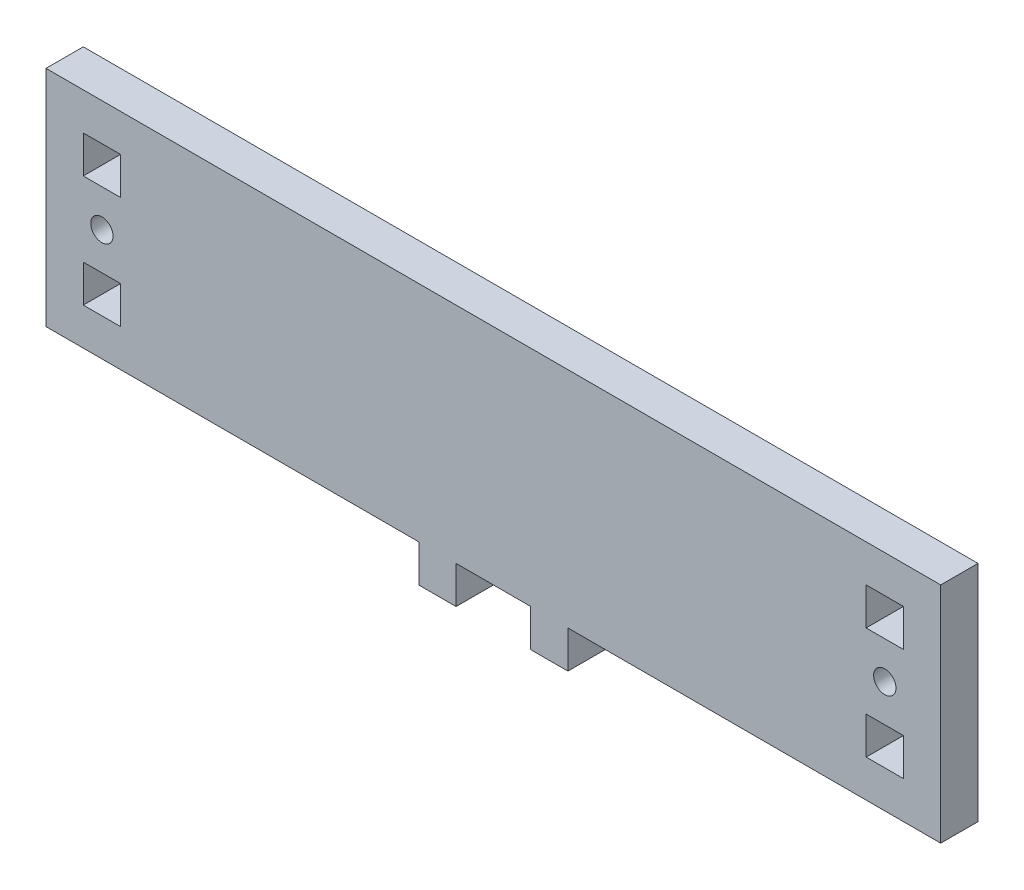
ISO-10303-21;
HEADER;
FILE_DESCRIPTION(('STEP AP214'),'2;1');
FILE_NAME('part.step','',(''),(''),'','','');
FILE_SCHEMA(('AUTOMOTIVE_DESIGN { 1 0 10303 214 1 1 1 1 }'));
ENDSEC;
DATA;
#1=APPLICATION_CONTEXT('core data for automotive mechanical design processes');
#2=APPLICATION_PROTOCOL_DEFINITION('international standard','automotive_design',2000,#1);
#3=PRODUCT_CONTEXT('',#1,'mechanical');
#4=PRODUCT('Part','Part','',(#3));
#5=PRODUCT_RELATED_PRODUCT_CATEGORY('part','',(#4));
#6=PRODUCT_DEFINITION_FORMATION('','',#4);
#7=PRODUCT_DEFINITION_CONTEXT('part definition',#1,'design');
#8=PRODUCT_DEFINITION('design','',#6,#7);
#9=PRODUCT_DEFINITION_SHAPE('','',#8);
#10=(LENGTH_UNIT() NAMED_UNIT(*) SI_UNIT(.MILLI.,.METRE.));
#11=(NAMED_UNIT(*) PLANE_ANGLE_UNIT() SI_UNIT($,.RADIAN.));
#12=(NAMED_UNIT(*) SI_UNIT($,.STERADIAN.) SOLID_ANGLE_UNIT());
#13=UNCERTAINTY_MEASURE_WITH_UNIT(LENGTH_MEASURE(1.E-05),#10,'distance_accuracy_value','');
#14=(GEOMETRIC_REPRESENTATION_CONTEXT(3) GLOBAL_UNCERTAINTY_ASSIGNED_CONTEXT((#13)) GLOBAL_UNIT_ASSIGNED_CONTEXT((#10,
#11,#12)) REPRESENTATION_CONTEXT('',''));
#15=CARTESIAN_POINT('',(0.,0.,0.));
#16=DIRECTION('',(0.,0.,1.));
#17=DIRECTION('',(1.,0.,0.));
#18=AXIS2_PLACEMENT_3D('',#15,#16,#17);
#19=CARTESIAN_POINT('',(0.,0.,5.));
#20=DIRECTION('',(0.,0.,-1.));
#21=DIRECTION('',(-1.,0.,0.));
#22=AXIS2_PLACEMENT_3D('',#19,#20,#21);
#23=PLANE('',#22);
#24=DIRECTION('',(-1.,0.,0.));
#25=VECTOR('',#24,1.);
#26=CARTESIAN_POINT('',(45.,15.0153904422342,5.));
#27=LINE('',#26,#25);
#28=CARTESIAN_POINT('',(50.,15.0153904422342,5.));
#29=VERTEX_POINT('',#28);
#30=CARTESIAN_POINT('',(45.,15.0153904422342,5.));
#31=VERTEX_POINT('',#30);
#32=EDGE_CURVE('E276',#29,#31,#27,.T.);
#33=ORIENTED_EDGE('',*,*,#32,.F.);
#34=DIRECTION('',(0.,1.,0.));
#35=VECTOR('',#34,1.);
#36=CARTESIAN_POINT('',(50.,15.0153904422342,5.));
#37=LINE('',#36,#35);
#38=CARTESIAN_POINT('',(50.,10.0153904422342,5.));
#39=VERTEX_POINT('',#38);
#40=EDGE_CURVE('E287',#39,#29,#37,.T.);
#41=ORIENTED_EDGE('',*,*,#40,.F.);
#42=DIRECTION('',(1.,0.,0.));
#43=VECTOR('',#42,1.);
#44=CARTESIAN_POINT('',(45.,10.0153904422342,5.));
#45=LINE('',#44,#43);
#46=CARTESIAN_POINT('',(45.,10.0153904422342,5.));
#47=VERTEX_POINT('',#46);
#48=EDGE_CURVE('E283',#47,#39,#45,.T.);
#49=ORIENTED_EDGE('',*,*,#48,.F.);
#50=DIRECTION('',(0.,-1.,0.));
#51=VECTOR('',#50,1.);
#52=CARTESIAN_POINT('',(45.,15.0153904422342,5.));
#53=LINE('',#52,#51);
#54=EDGE_CURVE('E279',#31,#47,#53,.T.);
#55=ORIENTED_EDGE('',*,*,#54,.F.);
#56=EDGE_LOOP('',(#33,#41,#49,#55));
#57=FACE_BOUND('',#56,.T.);
#58=DIRECTION('',(-1.,0.,0.));
#59=VECTOR('',#58,1.);
#60=CARTESIAN_POINT('',(-60.,15.0153904422342,5.));
#61=LINE('',#60,#59);
#62=CARTESIAN_POINT('',(-55.,15.0153904422342,5.));
#63=VERTEX_POINT('',#62);
#64=CARTESIAN_POINT('',(-60.,15.0153904422342,5.));
#65=VERTEX_POINT('',#64);
#66=EDGE_CURVE('E370',#63,#65,#61,.T.);
#67=ORIENTED_EDGE('',*,*,#66,.F.);
#68=DIRECTION('',(0.,1.,0.));
#69=VECTOR('',#68,1.);
#70=CARTESIAN_POINT('',(-55.,15.0153904422342,5.));
#71=LINE('',#70,#69);
#72=CARTESIAN_POINT('',(-55.,10.0153904422342,5.));
#73=VERTEX_POINT('',#72);
#74=EDGE_CURVE('E381',#73,#63,#71,.T.);
#75=ORIENTED_EDGE('',*,*,#74,.F.);
#76=DIRECTION('',(1.,0.,0.));
#77=VECTOR('',#76,1.);
#78=CARTESIAN_POINT('',(-60.,10.0153904422342,5.));
#79=LINE('',#78,#77);
#80=CARTESIAN_POINT('',(-60.,10.0153904422342,5.));
#81=VERTEX_POINT('',#80);
#82=EDGE_CURVE('E377',#81,#73,#79,.T.);
#83=ORIENTED_EDGE('',*,*,#82,.F.);
#84=DIRECTION('',(0.,-1.,0.));
#85=VECTOR('',#84,1.);
#86=CARTESIAN_POINT('',(-60.,15.0153904422342,5.));
#87=LINE('',#86,#85);
#88=EDGE_CURVE('E373',#65,#81,#87,.T.);
#89=ORIENTED_EDGE('',*,*,#88,.F.);
#90=EDGE_LOOP('',(#67,#75,#83,#89));
#91=FACE_BOUND('',#90,.T.);
#92=DIRECTION('',(1.,0.,0.));
#93=VECTOR('',#92,1.);
#94=CARTESIAN_POINT('',(5.,0.,5.));
#95=LINE('',#94,#93);
#96=CARTESIAN_POINT('',(0.,0.,5.));
#97=VERTEX_POINT('',#96);
#98=CARTESIAN_POINT('',(5.,0.,5.));
#99=VERTEX_POINT('',#98);
#100=EDGE_CURVE('E413',#97,#99,#95,.T.);
#101=ORIENTED_EDGE('',*,*,#100,.T.);
#102=DIRECTION('',(0.,1.,0.));
#103=VECTOR('',#102,1.);
#104=CARTESIAN_POINT('',(5.,5.01539044223422,5.));
#105=LINE('',#104,#103);
#106=CARTESIAN_POINT('',(5.,5.01539044223422,5.));
#107=VERTEX_POINT('',#106);
#108=EDGE_CURVE('E417',#99,#107,#105,.T.);
#109=ORIENTED_EDGE('',*,*,#108,.T.);
#110=DIRECTION('',(1.,0.,0.));
#111=VECTOR('',#110,1.);
#112=CARTESIAN_POINT('',(55.,5.01539044223421,5.));
#113=LINE('',#112,#111);
#114=CARTESIAN_POINT('',(55.,5.01539044223421,5.));
#115=VERTEX_POINT('',#114);
#116=EDGE_CURVE('E421',#107,#115,#113,.T.);
#117=ORIENTED_EDGE('',*,*,#116,.T.);
#118=DIRECTION('',(0.,1.,0.));
#119=VECTOR('',#118,1.);
#120=CARTESIAN_POINT('',(55.,35.0153904422342,5.));
#121=LINE('',#120,#119);
#122=CARTESIAN_POINT('',(55.,35.0153904422342,5.));
#123=VERTEX_POINT('',#122);
#124=EDGE_CURVE('E424',#115,#123,#121,.T.);
#125=ORIENTED_EDGE('',*,*,#124,.T.);
#126=DIRECTION('',(-1.,0.,0.));
#127=VECTOR('',#126,1.);
#128=CARTESIAN_POINT('',(-65.,35.0153904422342,5.));
#129=LINE('',#128,#127);
#130=CARTESIAN_POINT('',(-65.,35.0153904422342,5.));
#131=VERTEX_POINT('',#130);
#132=EDGE_CURVE('E427',#123,#131,#129,.T.);
#133=ORIENTED_EDGE('',*,*,#132,.T.);
#134=DIRECTION('',(0.,-1.,0.));
#135=VECTOR('',#134,1.);
#136=CARTESIAN_POINT('',(-65.,5.01539044223421,5.));
#137=LINE('',#136,#135);
#138=CARTESIAN_POINT('',(-65.,5.01539044223421,5.));
#139=VERTEX_POINT('',#138);
#140=EDGE_CURVE('E430',#131,#139,#137,.T.);
#141=ORIENTED_EDGE('',*,*,#140,.T.);
#142=DIRECTION('',(1.,0.,0.));
#143=VECTOR('',#142,1.);
#144=CARTESIAN_POINT('',(-15.,5.01539044223421,5.));
#145=LINE('',#144,#143);
#146=CARTESIAN_POINT('',(-15.,5.01539044223421,5.));
#147=VERTEX_POINT('',#146);
#148=EDGE_CURVE('E433',#139,#147,#145,.T.);
#149=ORIENTED_EDGE('',*,*,#148,.T.);
#150=DIRECTION('',(0.,-1.,0.));
#151=VECTOR('',#150,1.);
#152=CARTESIAN_POINT('',(-15.,0.,5.));
#153=LINE('',#152,#151);
#154=CARTESIAN_POINT('',(-15.,0.,5.));
#155=VERTEX_POINT('',#154);
#156=EDGE_CURVE('E436',#147,#155,#153,.T.);
#157=ORIENTED_EDGE('',*,*,#156,.T.);
#158=DIRECTION('',(1.,0.,0.));
#159=VECTOR('',#158,1.);
#160=CARTESIAN_POINT('',(-10.,0.,5.));
#161=LINE('',#160,#159);
#162=CARTESIAN_POINT('',(-10.,0.,5.));
#163=VERTEX_POINT('',#162);
#164=EDGE_CURVE('E439',#155,#163,#161,.T.);
#165=ORIENTED_EDGE('',*,*,#164,.T.);
#166=DIRECTION('',(0.,1.,0.));
#167=VECTOR('',#166,1.);
#168=CARTESIAN_POINT('',(-10.,5.01539044223422,5.));
#169=LINE('',#168,#167);
#170=CARTESIAN_POINT('',(-10.,5.01539044223422,5.));
#171=VERTEX_POINT('',#170);
#172=EDGE_CURVE('E442',#163,#171,#169,.T.);
#173=ORIENTED_EDGE('',*,*,#172,.T.);
#174=DIRECTION('',(1.,0.,0.));
#175=VECTOR('',#174,1.);
#176=CARTESIAN_POINT('',(0.,5.01539044223422,5.));
#177=LINE('',#176,#175);
#178=CARTESIAN_POINT('',(0.,5.01539044223422,5.));
#179=VERTEX_POINT('',#178);
#180=EDGE_CURVE('E445',#171,#179,#177,.T.);
#181=ORIENTED_EDGE('',*,*,#180,.T.);
#182=DIRECTION('',(0.,-1.,0.));
#183=VECTOR('',#182,1.);
#184=CARTESIAN_POINT('',(0.,0.,5.));
#185=LINE('',#184,#183);
#186=EDGE_CURVE('E448',#179,#97,#185,.T.);
#187=ORIENTED_EDGE('',*,*,#186,.T.);
#188=EDGE_LOOP('',(#101,#109,#117,#125,#133,#141,#149,#157,#165,#173,#181,#187));
#189=FACE_BOUND('',#188,.T.);
#190=DIRECTION('',(1.,0.,0.));
#191=VECTOR('',#190,1.);
#192=CARTESIAN_POINT('',(-60.,25.0153904422342,5.));
#193=LINE('',#192,#191);
#194=CARTESIAN_POINT('',(-60.,25.0153904422342,5.));
#195=VERTEX_POINT('',#194);
#196=CARTESIAN_POINT('',(-55.,25.0153904422342,5.));
#197=VERTEX_POINT('',#196);
#198=EDGE_CURVE('E327',#195,#197,#193,.T.);
#199=ORIENTED_EDGE('',*,*,#198,.F.);
#200=DIRECTION('',(0.,-1.,0.));
#201=VECTOR('',#200,1.);
#202=CARTESIAN_POINT('',(-60.,25.0153904422342,5.));
#203=LINE('',#202,#201);
#204=CARTESIAN_POINT('',(-60.,30.0153904422342,5.));
#205=VERTEX_POINT('',#204);
#206=EDGE_CURVE('E338',#205,#195,#203,.T.);
#207=ORIENTED_EDGE('',*,*,#206,.F.);
#208=DIRECTION('',(-1.,0.,0.));
#209=VECTOR('',#208,1.);
#210=CARTESIAN_POINT('',(-60.,30.0153904422342,5.));
#211=LINE('',#210,#209);
#212=CARTESIAN_POINT('',(-55.,30.0153904422342,5.));
#213=VERTEX_POINT('',#212);
#214=EDGE_CURVE('E334',#213,#205,#211,.T.);
#215=ORIENTED_EDGE('',*,*,#214,.F.);
#216=DIRECTION('',(0.,1.,0.));
#217=VECTOR('',#216,1.);
#218=CARTESIAN_POINT('',(-55.,25.0153904422342,5.));
#219=LINE('',#218,#217);
#220=EDGE_CURVE('E330',#197,#213,#219,.T.);
#221=ORIENTED_EDGE('',*,*,#220,.F.);
#222=EDGE_LOOP('',(#199,#207,#215,#221));
#223=FACE_BOUND('',#222,.T.);
#224=CARTESIAN_POINT('',(-57.5,20.0153904422342,5.));
#225=DIRECTION('',(0.,0.,1.));
#226=DIRECTION('',(1.,0.,0.));
#227=AXIS2_PLACEMENT_3D('',#224,#225,#226);
#228=CIRCLE('',#227,1.5);
#229=CARTESIAN_POINT('',(-56.,20.0153904422342,5.));
#230=VERTEX_POINT('',#229);
#231=EDGE_CURVE('E319',#230,#230,#228,.T.);
#232=ORIENTED_EDGE('',*,*,#231,.F.);
#233=EDGE_LOOP('',(#232));
#234=FACE_BOUND('',#233,.T.);
#235=DIRECTION('',(1.,0.,0.));
#236=VECTOR('',#235,1.);
#237=CARTESIAN_POINT('',(45.,25.0153904422342,5.));
#238=LINE('',#237,#236);
#239=CARTESIAN_POINT('',(45.,25.0153904422342,5.));
#240=VERTEX_POINT('',#239);
#241=CARTESIAN_POINT('',(50.,25.0153904422342,5.));
#242=VERTEX_POINT('',#241);
#243=EDGE_CURVE('E225',#240,#242,#238,.T.);
#244=ORIENTED_EDGE('',*,*,#243,.F.);
#245=DIRECTION('',(0.,-1.,0.));
#246=VECTOR('',#245,1.);
#247=CARTESIAN_POINT('',(45.,25.0153904422342,5.));
#248=LINE('',#247,#246);
#249=CARTESIAN_POINT('',(45.,30.0153904422342,5.));
#250=VERTEX_POINT('',#249);
#251=EDGE_CURVE('E252',#250,#240,#248,.T.);
#252=ORIENTED_EDGE('',*,*,#251,.F.);
#253=DIRECTION('',(-1.,0.,0.));
#254=VECTOR('',#253,1.);
#255=CARTESIAN_POINT('',(45.,30.0153904422342,5.));
#256=LINE('',#255,#254);
#257=CARTESIAN_POINT('',(50.,30.0153904422342,5.));
#258=VERTEX_POINT('',#257);
#259=EDGE_CURVE('E248',#258,#250,#256,.T.);
#260=ORIENTED_EDGE('',*,*,#259,.F.);
#261=DIRECTION('',(0.,1.,0.));
#262=VECTOR('',#261,1.);
#263=CARTESIAN_POINT('',(50.,25.0153904422342,5.));
#264=LINE('',#263,#262);
#265=EDGE_CURVE('E234',#242,#258,#264,.T.);
#266=ORIENTED_EDGE('',*,*,#265,.F.);
#267=EDGE_LOOP('',(#244,#252,#260,#266));
#268=FACE_BOUND('',#267,.T.);
#269=CARTESIAN_POINT('',(47.5,20.0153904422342,5.));
#270=DIRECTION('',(0.,0.,1.));
#271=DIRECTION('',(1.,0.,0.));
#272=AXIS2_PLACEMENT_3D('',#269,#270,#271);
#273=CIRCLE('',#272,1.5);
#274=CARTESIAN_POINT('',(49.,20.0153904422342,5.));
#275=VERTEX_POINT('',#274);
#276=EDGE_CURVE('E260',#275,#275,#273,.T.);
#277=ORIENTED_EDGE('',*,*,#276,.F.);
#278=EDGE_LOOP('',(#277));
#279=FACE_BOUND('',#278,.T.);
#280=ADVANCED_FACE('F39',(#57,#91,#189,#223,#234,#268,#279),#23,.F.);
#281=CARTESIAN_POINT('',(0.,0.,0.));
#282=DIRECTION('',(0.,0.,-1.));
#283=DIRECTION('',(-1.,0.,0.));
#284=AXIS2_PLACEMENT_3D('',#281,#282,#283);
#285=PLANE('',#284);
#286=DIRECTION('',(0.,-1.,0.));
#287=VECTOR('',#286,1.);
#288=CARTESIAN_POINT('',(45.,25.0153904422342,0.));
#289=LINE('',#288,#287);
#290=CARTESIAN_POINT('',(45.,30.0153904422342,0.));
#291=VERTEX_POINT('',#290);
#292=CARTESIAN_POINT('',(45.,25.0153904422342,0.));
#293=VERTEX_POINT('',#292);
#294=EDGE_CURVE('E235',#291,#293,#289,.T.);
#295=ORIENTED_EDGE('',*,*,#294,.T.);
#296=DIRECTION('',(1.,0.,0.));
#297=VECTOR('',#296,1.);
#298=CARTESIAN_POINT('',(45.,25.0153904422342,0.));
#299=LINE('',#298,#297);
#300=CARTESIAN_POINT('',(50.,25.0153904422342,0.));
#301=VERTEX_POINT('',#300);
#302=EDGE_CURVE('E63',#293,#301,#299,.T.);
#303=ORIENTED_EDGE('',*,*,#302,.T.);
#304=DIRECTION('',(0.,1.,0.));
#305=VECTOR('',#304,1.);
#306=CARTESIAN_POINT('',(50.,25.0153904422342,0.));
#307=LINE('',#306,#305);
#308=CARTESIAN_POINT('',(50.,30.0153904422342,0.));
#309=VERTEX_POINT('',#308);
#310=EDGE_CURVE('E241',#301,#309,#307,.T.);
#311=ORIENTED_EDGE('',*,*,#310,.T.);
#312=DIRECTION('',(-1.,0.,0.));
#313=VECTOR('',#312,1.);
#314=CARTESIAN_POINT('',(45.,30.0153904422342,0.));
#315=LINE('',#314,#313);
#316=EDGE_CURVE('E263',#309,#291,#315,.T.);
#317=ORIENTED_EDGE('',*,*,#316,.T.);
#318=EDGE_LOOP('',(#295,#303,#311,#317));
#319=FACE_BOUND('',#318,.T.);
#320=DIRECTION('',(0.,1.,0.));
#321=VECTOR('',#320,1.);
#322=CARTESIAN_POINT('',(50.,15.0153904422342,0.));
#323=LINE('',#322,#321);
#324=CARTESIAN_POINT('',(50.,10.0153904422342,0.));
#325=VERTEX_POINT('',#324);
#326=CARTESIAN_POINT('',(50.,15.0153904422342,0.));
#327=VERTEX_POINT('',#326);
#328=EDGE_CURVE('E280',#325,#327,#323,.T.);
#329=ORIENTED_EDGE('',*,*,#328,.T.);
#330=DIRECTION('',(-1.,0.,0.));
#331=VECTOR('',#330,1.);
#332=CARTESIAN_POINT('',(45.,15.0153904422342,0.));
#333=LINE('',#332,#331);
#334=CARTESIAN_POINT('',(45.,15.0153904422342,0.));
#335=VERTEX_POINT('',#334);
#336=EDGE_CURVE('E243',#327,#335,#333,.T.);
#337=ORIENTED_EDGE('',*,*,#336,.T.);
#338=DIRECTION('',(0.,-1.,0.));
#339=VECTOR('',#338,1.);
#340=CARTESIAN_POINT('',(45.,15.0153904422342,0.));
#341=LINE('',#340,#339);
#342=CARTESIAN_POINT('',(45.,10.0153904422342,0.));
#343=VERTEX_POINT('',#342);
#344=EDGE_CURVE('E294',#335,#343,#341,.T.);
#345=ORIENTED_EDGE('',*,*,#344,.T.);
#346=DIRECTION('',(1.,0.,0.));
#347=VECTOR('',#346,1.);
#348=CARTESIAN_POINT('',(45.,10.0153904422342,0.));
#349=LINE('',#348,#347);
#350=EDGE_CURVE('E298',#343,#325,#349,.T.);
#351=ORIENTED_EDGE('',*,*,#350,.T.);
#352=EDGE_LOOP('',(#329,#337,#345,#351));
#353=FACE_BOUND('',#352,.T.);
#354=CARTESIAN_POINT('',(-57.5,20.0153904422342,0.));
#355=DIRECTION('',(0.,0.,1.));
#356=DIRECTION('',(1.,0.,0.));
#357=AXIS2_PLACEMENT_3D('',#354,#355,#356);
#358=CIRCLE('',#357,1.5);
#359=CARTESIAN_POINT('',(-56.,20.0153904422342,0.));
#360=VERTEX_POINT('',#359);
#361=EDGE_CURVE('E318',#360,#360,#358,.T.);
#362=ORIENTED_EDGE('',*,*,#361,.T.);
#363=EDGE_LOOP('',(#362));
#364=FACE_BOUND('',#363,.T.);
#365=DIRECTION('',(1.,0.,0.));
#366=VECTOR('',#365,1.);
#367=CARTESIAN_POINT('',(5.,0.,0.));
#368=LINE('',#367,#366);
#369=CARTESIAN_POINT('',(0.,0.,0.));
#370=VERTEX_POINT('',#369);
#371=CARTESIAN_POINT('',(5.,0.,0.));
#372=VERTEX_POINT('',#371);
#373=EDGE_CURVE('E412',#370,#372,#368,.T.);
#374=ORIENTED_EDGE('',*,*,#373,.F.);
#375=DIRECTION('',(0.,-1.,0.));
#376=VECTOR('',#375,1.);
#377=CARTESIAN_POINT('',(0.,0.,0.));
#378=LINE('',#377,#376);
#379=CARTESIAN_POINT('',(0.,5.01539044223422,0.));
#380=VERTEX_POINT('',#379);
#381=EDGE_CURVE('E418',#380,#370,#378,.T.);
#382=ORIENTED_EDGE('',*,*,#381,.F.);
#383=DIRECTION('',(1.,0.,0.));
#384=VECTOR('',#383,1.);
#385=CARTESIAN_POINT('',(0.,5.01539044223422,0.));
#386=LINE('',#385,#384);
#387=CARTESIAN_POINT('',(-10.,5.01539044223422,0.));
#388=VERTEX_POINT('',#387);
#389=EDGE_CURVE('E482',#388,#380,#386,.T.);
#390=ORIENTED_EDGE('',*,*,#389,.F.);
#391=DIRECTION('',(0.,1.,0.));
#392=VECTOR('',#391,1.);
#393=CARTESIAN_POINT('',(-10.,5.01539044223422,0.));
#394=LINE('',#393,#392);
#395=CARTESIAN_POINT('',(-10.,0.,0.));
#396=VERTEX_POINT('',#395);
#397=EDGE_CURVE('E479',#396,#388,#394,.T.);
#398=ORIENTED_EDGE('',*,*,#397,.F.);
#399=DIRECTION('',(1.,0.,0.));
#400=VECTOR('',#399,1.);
#401=CARTESIAN_POINT('',(-10.,0.,0.));
#402=LINE('',#401,#400);
#403=CARTESIAN_POINT('',(-15.,0.,0.));
#404=VERTEX_POINT('',#403);
#405=EDGE_CURVE('E476',#404,#396,#402,.T.);
#406=ORIENTED_EDGE('',*,*,#405,.F.);
#407=DIRECTION('',(0.,-1.,0.));
#408=VECTOR('',#407,1.);
#409=CARTESIAN_POINT('',(-15.,0.,0.));
#410=LINE('',#409,#408);
#411=CARTESIAN_POINT('',(-15.,5.01539044223421,0.));
#412=VERTEX_POINT('',#411);
#413=EDGE_CURVE('E473',#412,#404,#410,.T.);
#414=ORIENTED_EDGE('',*,*,#413,.F.);
#415=DIRECTION('',(1.,0.,0.));
#416=VECTOR('',#415,1.);
#417=CARTESIAN_POINT('',(-15.,5.01539044223421,0.));
#418=LINE('',#417,#416);
#419=CARTESIAN_POINT('',(-65.,5.01539044223421,0.));
#420=VERTEX_POINT('',#419);
#421=EDGE_CURVE('E470',#420,#412,#418,.T.);
#422=ORIENTED_EDGE('',*,*,#421,.F.);
#423=DIRECTION('',(0.,-1.,0.));
#424=VECTOR('',#423,1.);
#425=CARTESIAN_POINT('',(-65.,5.01539044223421,0.));
#426=LINE('',#425,#424);
#427=CARTESIAN_POINT('',(-65.,35.0153904422342,0.));
#428=VERTEX_POINT('',#427);
#429=EDGE_CURVE('E467',#428,#420,#426,.T.);
#430=ORIENTED_EDGE('',*,*,#429,.F.);
#431=DIRECTION('',(-1.,0.,0.));
#432=VECTOR('',#431,1.);
#433=CARTESIAN_POINT('',(-65.,35.0153904422342,0.));
#434=LINE('',#433,#432);
#435=CARTESIAN_POINT('',(55.,35.0153904422342,0.));
#436=VERTEX_POINT('',#435);
#437=EDGE_CURVE('E464',#436,#428,#434,.T.);
#438=ORIENTED_EDGE('',*,*,#437,.F.);
#439=DIRECTION('',(0.,1.,0.));
#440=VECTOR('',#439,1.);
#441=CARTESIAN_POINT('',(55.,35.0153904422342,0.));
#442=LINE('',#441,#440);
#443=CARTESIAN_POINT('',(55.,5.01539044223421,0.));
#444=VERTEX_POINT('',#443);
#445=EDGE_CURVE('E461',#444,#436,#442,.T.);
#446=ORIENTED_EDGE('',*,*,#445,.F.);
#447=DIRECTION('',(1.,0.,0.));
#448=VECTOR('',#447,1.);
#449=CARTESIAN_POINT('',(55.,5.01539044223421,0.));
#450=LINE('',#449,#448);
#451=CARTESIAN_POINT('',(5.,5.01539044223422,0.));
#452=VERTEX_POINT('',#451);
#453=EDGE_CURVE('E458',#452,#444,#450,.T.);
#454=ORIENTED_EDGE('',*,*,#453,.F.);
#455=DIRECTION('',(0.,1.,0.));
#456=VECTOR('',#455,1.);
#457=CARTESIAN_POINT('',(5.,5.01539044223422,0.));
#458=LINE('',#457,#456);
#459=EDGE_CURVE('E455',#372,#452,#458,.T.);
#460=ORIENTED_EDGE('',*,*,#459,.F.);
#461=EDGE_LOOP('',(#374,#382,#390,#398,#406,#414,#422,#430,#438,#446,#454,#460));
#462=FACE_BOUND('',#461,.T.);
#463=DIRECTION('',(0.,1.,0.));
#464=VECTOR('',#463,1.);
#465=CARTESIAN_POINT('',(-55.,15.0153904422342,0.));
#466=LINE('',#465,#464);
#467=CARTESIAN_POINT('',(-55.,10.0153904422342,0.));
#468=VERTEX_POINT('',#467);
#469=CARTESIAN_POINT('',(-55.,15.0153904422342,0.));
#470=VERTEX_POINT('',#469);
#471=EDGE_CURVE('E374',#468,#470,#466,.T.);
#472=ORIENTED_EDGE('',*,*,#471,.T.);
#473=DIRECTION('',(-1.,0.,0.));
#474=VECTOR('',#473,1.);
#475=CARTESIAN_POINT('',(-60.,15.0153904422342,0.));
#476=LINE('',#475,#474);
#477=CARTESIAN_POINT('',(-60.,15.0153904422342,0.));
#478=VERTEX_POINT('',#477);
#479=EDGE_CURVE('E369',#470,#478,#476,.T.);
#480=ORIENTED_EDGE('',*,*,#479,.T.);
#481=DIRECTION('',(0.,-1.,0.));
#482=VECTOR('',#481,1.);
#483=CARTESIAN_POINT('',(-60.,15.0153904422342,0.));
#484=LINE('',#483,#482);
#485=CARTESIAN_POINT('',(-60.,10.0153904422342,0.));
#486=VERTEX_POINT('',#485);
#487=EDGE_CURVE('E388',#478,#486,#484,.T.);
#488=ORIENTED_EDGE('',*,*,#487,.T.);
#489=DIRECTION('',(1.,0.,0.));
#490=VECTOR('',#489,1.);
#491=CARTESIAN_POINT('',(-60.,10.0153904422342,0.));
#492=LINE('',#491,#490);
#493=EDGE_CURVE('E392',#486,#468,#492,.T.);
#494=ORIENTED_EDGE('',*,*,#493,.T.);
#495=EDGE_LOOP('',(#472,#480,#488,#494));
#496=FACE_BOUND('',#495,.T.);
#497=DIRECTION('',(0.,-1.,0.));
#498=VECTOR('',#497,1.);
#499=CARTESIAN_POINT('',(-60.,25.0153904422342,0.));
#500=LINE('',#499,#498);
#501=CARTESIAN_POINT('',(-60.,30.0153904422342,0.));
#502=VERTEX_POINT('',#501);
#503=CARTESIAN_POINT('',(-60.,25.0153904422342,0.));
#504=VERTEX_POINT('',#503);
#505=EDGE_CURVE('E331',#502,#504,#500,.T.);
#506=ORIENTED_EDGE('',*,*,#505,.T.);
#507=DIRECTION('',(1.,0.,0.));
#508=VECTOR('',#507,1.);
#509=CARTESIAN_POINT('',(-60.,25.0153904422342,0.));
#510=LINE('',#509,#508);
#511=CARTESIAN_POINT('',(-55.,25.0153904422342,0.));
#512=VERTEX_POINT('',#511);
#513=EDGE_CURVE('E323',#504,#512,#510,.T.);
#514=ORIENTED_EDGE('',*,*,#513,.T.);
#515=DIRECTION('',(0.,1.,0.));
#516=VECTOR('',#515,1.);
#517=CARTESIAN_POINT('',(-55.,25.0153904422342,0.));
#518=LINE('',#517,#516);
#519=CARTESIAN_POINT('',(-55.,30.0153904422342,0.));
#520=VERTEX_POINT('',#519);
#521=EDGE_CURVE('E345',#512,#520,#518,.T.);
#522=ORIENTED_EDGE('',*,*,#521,.T.);
#523=DIRECTION('',(-1.,0.,0.));
#524=VECTOR('',#523,1.);
#525=CARTESIAN_POINT('',(-60.,30.0153904422342,0.));
#526=LINE('',#525,#524);
#527=EDGE_CURVE('E349',#520,#502,#526,.T.);
#528=ORIENTED_EDGE('',*,*,#527,.T.);
#529=EDGE_LOOP('',(#506,#514,#522,#528));
#530=FACE_BOUND('',#529,.T.);
#531=CARTESIAN_POINT('',(47.5,20.0153904422342,0.));
#532=DIRECTION('',(0.,0.,1.));
#533=DIRECTION('',(1.,0.,0.));
#534=AXIS2_PLACEMENT_3D('',#531,#532,#533);
#535=CIRCLE('',#534,1.5);
#536=CARTESIAN_POINT('',(49.,20.0153904422342,0.));
#537=VERTEX_POINT('',#536);
#538=EDGE_CURVE('E883',#537,#537,#535,.T.);
#539=ORIENTED_EDGE('',*,*,#538,.T.);
#540=EDGE_LOOP('',(#539));
#541=FACE_BOUND('',#540,.T.);
#542=ADVANCED_FACE('F537',(#319,#353,#364,#462,#496,#530,#541),#285,.T.);
#543=CARTESIAN_POINT('',(5.,0.,5.));
#544=DIRECTION('',(0.,1.,0.));
#545=DIRECTION('',(-1.,0.,0.));
#546=AXIS2_PLACEMENT_3D('',#543,#544,#545);
#547=PLANE('',#546);
#548=ORIENTED_EDGE('',*,*,#373,.T.);
#549=DIRECTION('',(0.,0.,-1.));
#550=VECTOR('',#549,1.);
#551=CARTESIAN_POINT('',(5.,0.,5.));
#552=LINE('',#551,#550);
#553=EDGE_CURVE('E11',#99,#372,#552,.T.);
#554=ORIENTED_EDGE('',*,*,#553,.F.);
#555=ORIENTED_EDGE('',*,*,#100,.F.);
#556=DIRECTION('',(0.,0.,-1.));
#557=VECTOR('',#556,1.);
#558=CARTESIAN_POINT('',(0.,0.,5.));
#559=LINE('',#558,#557);
#560=EDGE_CURVE('E451',#97,#370,#559,.T.);
#561=ORIENTED_EDGE('',*,*,#560,.T.);
#562=EDGE_LOOP('',(#548,#554,#555,#561));
#563=FACE_BOUND('',#562,.T.);
#564=ADVANCED_FACE('F41',(#563),#547,.F.);
#565=CARTESIAN_POINT('',(5.,5.01539044223422,5.));
#566=DIRECTION('',(-1.,0.,0.));
#567=DIRECTION('',(0.,-1.,0.));
#568=AXIS2_PLACEMENT_3D('',#565,#566,#567);
#569=PLANE('',#568);
#570=ORIENTED_EDGE('',*,*,#459,.T.);
#571=DIRECTION('',(0.,0.,-1.));
#572=VECTOR('',#571,1.);
#573=CARTESIAN_POINT('',(5.,5.01539044223422,5.));
#574=LINE('',#573,#572);
#575=EDGE_CURVE('E48',#107,#452,#574,.T.);
#576=ORIENTED_EDGE('',*,*,#575,.F.);
#577=ORIENTED_EDGE('',*,*,#108,.F.);
#578=ORIENTED_EDGE('',*,*,#553,.T.);
#579=EDGE_LOOP('',(#570,#576,#577,#578));
#580=FACE_BOUND('',#579,.T.);
#581=ADVANCED_FACE('F555',(#580),#569,.F.);
#582=CARTESIAN_POINT('',(55.,5.01539044223421,5.));
#583=DIRECTION('',(0.,1.,0.));
#584=DIRECTION('',(-1.,0.,0.));
#585=AXIS2_PLACEMENT_3D('',#582,#583,#584);
#586=PLANE('',#585);
#587=ORIENTED_EDGE('',*,*,#453,.T.);
#588=DIRECTION('',(0.,0.,-1.));
#589=VECTOR('',#588,1.);
#590=CARTESIAN_POINT('',(55.,5.01539044223421,5.));
#591=LINE('',#590,#589);
#592=EDGE_CURVE('E522',#115,#444,#591,.T.);
#593=ORIENTED_EDGE('',*,*,#592,.F.);
#594=ORIENTED_EDGE('',*,*,#116,.F.);
#595=ORIENTED_EDGE('',*,*,#575,.T.);
#596=EDGE_LOOP('',(#587,#593,#594,#595));
#597=FACE_BOUND('',#596,.T.);
#598=ADVANCED_FACE('F531',(#597),#586,.F.);
#599=CARTESIAN_POINT('',(55.,35.0153904422342,5.));
#600=DIRECTION('',(-1.,0.,0.));
#601=DIRECTION('',(0.,0.,1.));
#602=AXIS2_PLACEMENT_3D('',#599,#600,#601);
#603=PLANE('',#602);
#604=ORIENTED_EDGE('',*,*,#445,.T.);
#605=DIRECTION('',(0.,0.,-1.));
#606=VECTOR('',#605,1.);
#607=CARTESIAN_POINT('',(55.,35.0153904422342,5.));
#608=LINE('',#607,#606);
#609=EDGE_CURVE('E518',#123,#436,#608,.T.);
#610=ORIENTED_EDGE('',*,*,#609,.F.);
#611=ORIENTED_EDGE('',*,*,#124,.F.);
#612=ORIENTED_EDGE('',*,*,#592,.T.);
#613=EDGE_LOOP('',(#604,#610,#611,#612));
#614=FACE_BOUND('',#613,.T.);
#615=ADVANCED_FACE('F543',(#614),#603,.F.);
#616=CARTESIAN_POINT('',(-65.,35.0153904422342,5.));
#617=DIRECTION('',(0.,-1.,0.));
#618=DIRECTION('',(0.,0.,-1.));
#619=AXIS2_PLACEMENT_3D('',#616,#617,#618);
#620=PLANE('',#619);
#621=ORIENTED_EDGE('',*,*,#437,.T.);
#622=DIRECTION('',(0.,0.,-1.));
#623=VECTOR('',#622,1.);
#624=CARTESIAN_POINT('',(-65.,35.0153904422342,5.));
#625=LINE('',#624,#623);
#626=EDGE_CURVE('E514',#131,#428,#625,.T.);
#627=ORIENTED_EDGE('',*,*,#626,.F.);
#628=ORIENTED_EDGE('',*,*,#132,.F.);
#629=ORIENTED_EDGE('',*,*,#609,.T.);
#630=EDGE_LOOP('',(#621,#627,#628,#629));
#631=FACE_BOUND('',#630,.T.);
#632=ADVANCED_FACE('F547',(#631),#620,.F.);
#633=CARTESIAN_POINT('',(-65.,5.01539044223421,5.));
#634=DIRECTION('',(1.,0.,0.));
#635=DIRECTION('',(0.,0.,-1.));
#636=AXIS2_PLACEMENT_3D('',#633,#634,#635);
#637=PLANE('',#636);
#638=ORIENTED_EDGE('',*,*,#429,.T.);
#639=DIRECTION('',(0.,0.,-1.));
#640=VECTOR('',#639,1.);
#641=CARTESIAN_POINT('',(-65.,5.01539044223421,5.));
#642=LINE('',#641,#640);
#643=EDGE_CURVE('E510',#139,#420,#642,.T.);
#644=ORIENTED_EDGE('',*,*,#643,.F.);
#645=ORIENTED_EDGE('',*,*,#140,.F.);
#646=ORIENTED_EDGE('',*,*,#626,.T.);
#647=EDGE_LOOP('',(#638,#644,#645,#646));
#648=FACE_BOUND('',#647,.T.);
#649=ADVANCED_FACE('F588',(#648),#637,.F.);
#650=CARTESIAN_POINT('',(-15.,5.01539044223421,5.));
#651=DIRECTION('',(0.,1.,0.));
#652=DIRECTION('',(0.,0.,1.));
#653=AXIS2_PLACEMENT_3D('',#650,#651,#652);
#654=PLANE('',#653);
#655=ORIENTED_EDGE('',*,*,#421,.T.);
#656=DIRECTION('',(0.,0.,-1.));
#657=VECTOR('',#656,1.);
#658=CARTESIAN_POINT('',(-15.,5.01539044223421,5.));
#659=LINE('',#658,#657);
#660=EDGE_CURVE('E506',#147,#412,#659,.T.);
#661=ORIENTED_EDGE('',*,*,#660,.F.);
#662=ORIENTED_EDGE('',*,*,#148,.F.);
#663=ORIENTED_EDGE('',*,*,#643,.T.);
#664=EDGE_LOOP('',(#655,#661,#662,#663));
#665=FACE_BOUND('',#664,.T.);
#666=ADVANCED_FACE('F586',(#665),#654,.F.);
#667=CARTESIAN_POINT('',(-15.,0.,5.));
#668=DIRECTION('',(1.,0.,0.));
#669=DIRECTION('',(0.,0.,-1.));
#670=AXIS2_PLACEMENT_3D('',#667,#668,#669);
#671=PLANE('',#670);
#672=ORIENTED_EDGE('',*,*,#413,.T.);
#673=DIRECTION('',(0.,0.,-1.));
#674=VECTOR('',#673,1.);
#675=CARTESIAN_POINT('',(-15.,0.,5.));
#676=LINE('',#675,#674);
#677=EDGE_CURVE('E502',#155,#404,#676,.T.);
#678=ORIENTED_EDGE('',*,*,#677,.F.);
#679=ORIENTED_EDGE('',*,*,#156,.F.);
#680=ORIENTED_EDGE('',*,*,#660,.T.);
#681=EDGE_LOOP('',(#672,#678,#679,#680));
#682=FACE_BOUND('',#681,.T.);
#683=ADVANCED_FACE('F582',(#682),#671,.F.);
#684=CARTESIAN_POINT('',(-10.,0.,5.));
#685=DIRECTION('',(0.,1.,0.));
#686=DIRECTION('',(-1.,0.,0.));
#687=AXIS2_PLACEMENT_3D('',#684,#685,#686);
#688=PLANE('',#687);
#689=ORIENTED_EDGE('',*,*,#405,.T.);
#690=DIRECTION('',(0.,0.,-1.));
#691=VECTOR('',#690,1.);
#692=CARTESIAN_POINT('',(-10.,0.,5.));
#693=LINE('',#692,#691);
#694=EDGE_CURVE('E498',#163,#396,#693,.T.);
#695=ORIENTED_EDGE('',*,*,#694,.F.);
#696=ORIENTED_EDGE('',*,*,#164,.F.);
#697=ORIENTED_EDGE('',*,*,#677,.T.);
#698=EDGE_LOOP('',(#689,#695,#696,#697));
#699=FACE_BOUND('',#698,.T.);
#700=ADVANCED_FACE('F577',(#699),#688,.F.);
#701=CARTESIAN_POINT('',(-10.,5.01539044223422,5.));
#702=DIRECTION('',(-1.,0.,0.));
#703=DIRECTION('',(0.,0.,1.));
#704=AXIS2_PLACEMENT_3D('',#701,#702,#703);
#705=PLANE('',#704);
#706=ORIENTED_EDGE('',*,*,#397,.T.);
#707=DIRECTION('',(0.,0.,-1.));
#708=VECTOR('',#707,1.);
#709=CARTESIAN_POINT('',(-10.,5.01539044223422,5.));
#710=LINE('',#709,#708);
#711=EDGE_CURVE('E494',#171,#388,#710,.T.);
#712=ORIENTED_EDGE('',*,*,#711,.F.);
#713=ORIENTED_EDGE('',*,*,#172,.F.);
#714=ORIENTED_EDGE('',*,*,#694,.T.);
#715=EDGE_LOOP('',(#706,#712,#713,#714));
#716=FACE_BOUND('',#715,.T.);
#717=ADVANCED_FACE('F571',(#716),#705,.F.);
#718=CARTESIAN_POINT('',(0.,5.01539044223422,5.));
#719=DIRECTION('',(0.,1.,0.));
#720=DIRECTION('',(0.,0.,1.));
#721=AXIS2_PLACEMENT_3D('',#718,#719,#720);
#722=PLANE('',#721);
#723=ORIENTED_EDGE('',*,*,#389,.T.);
#724=DIRECTION('',(0.,0.,-1.));
#725=VECTOR('',#724,1.);
#726=CARTESIAN_POINT('',(0.,5.01539044223422,5.));
#727=LINE('',#726,#725);
#728=EDGE_CURVE('E490',#179,#380,#727,.T.);
#729=ORIENTED_EDGE('',*,*,#728,.F.);
#730=ORIENTED_EDGE('',*,*,#180,.F.);
#731=ORIENTED_EDGE('',*,*,#711,.T.);
#732=EDGE_LOOP('',(#723,#729,#730,#731));
#733=FACE_BOUND('',#732,.T.);
#734=ADVANCED_FACE('F567',(#733),#722,.F.);
#735=CARTESIAN_POINT('',(0.,0.,5.));
#736=DIRECTION('',(1.,0.,0.));
#737=DIRECTION('',(0.,1.,0.));
#738=AXIS2_PLACEMENT_3D('',#735,#736,#737);
#739=PLANE('',#738);
#740=ORIENTED_EDGE('',*,*,#381,.T.);
#741=ORIENTED_EDGE('',*,*,#560,.F.);
#742=ORIENTED_EDGE('',*,*,#186,.F.);
#743=ORIENTED_EDGE('',*,*,#728,.T.);
#744=EDGE_LOOP('',(#740,#741,#742,#743));
#745=FACE_BOUND('',#744,.T.);
#746=ADVANCED_FACE('F562',(#745),#739,.F.);
#747=CARTESIAN_POINT('',(-60.,15.0153904422342,5.));
#748=DIRECTION('',(0.,-1.,0.));
#749=DIRECTION('',(0.,0.,-1.));
#750=AXIS2_PLACEMENT_3D('',#747,#748,#749);
#751=PLANE('',#750);
#752=ORIENTED_EDGE('',*,*,#479,.F.);
#753=DIRECTION('',(0.,0.,-1.));
#754=VECTOR('',#753,1.);
#755=CARTESIAN_POINT('',(-55.,15.0153904422342,5.));
#756=LINE('',#755,#754);
#757=EDGE_CURVE('E384',#63,#470,#756,.T.);
#758=ORIENTED_EDGE('',*,*,#757,.F.);
#759=ORIENTED_EDGE('',*,*,#66,.T.);
#760=DIRECTION('',(0.,0.,-1.));
#761=VECTOR('',#760,1.);
#762=CARTESIAN_POINT('',(-60.,15.0153904422342,5.));
#763=LINE('',#762,#761);
#764=EDGE_CURVE('E408',#65,#478,#763,.T.);
#765=ORIENTED_EDGE('',*,*,#764,.T.);
#766=EDGE_LOOP('',(#752,#758,#759,#765));
#767=FACE_BOUND('',#766,.T.);
#768=ADVANCED_FACE('F608',(#767),#751,.T.);
#769=CARTESIAN_POINT('',(-60.,15.0153904422342,5.));
#770=DIRECTION('',(1.,0.,0.));
#771=DIRECTION('',(0.,0.,-1.));
#772=AXIS2_PLACEMENT_3D('',#769,#770,#771);
#773=PLANE('',#772);
#774=ORIENTED_EDGE('',*,*,#487,.F.);
#775=ORIENTED_EDGE('',*,*,#764,.F.);
#776=ORIENTED_EDGE('',*,*,#88,.T.);
#777=DIRECTION('',(0.,0.,-1.));
#778=VECTOR('',#777,1.);
#779=CARTESIAN_POINT('',(-60.,10.0153904422342,5.));
#780=LINE('',#779,#778);
#781=EDGE_CURVE('E405',#81,#486,#780,.T.);
#782=ORIENTED_EDGE('',*,*,#781,.T.);
#783=EDGE_LOOP('',(#774,#775,#776,#782));
#784=FACE_BOUND('',#783,.T.);
#785=ADVANCED_FACE('F646',(#784),#773,.T.);
#786=CARTESIAN_POINT('',(-60.,10.0153904422342,5.));
#787=DIRECTION('',(0.,1.,0.));
#788=DIRECTION('',(0.,0.,1.));
#789=AXIS2_PLACEMENT_3D('',#786,#787,#788);
#790=PLANE('',#789);
#791=ORIENTED_EDGE('',*,*,#493,.F.);
#792=ORIENTED_EDGE('',*,*,#781,.F.);
#793=ORIENTED_EDGE('',*,*,#82,.T.);
#794=DIRECTION('',(0.,0.,-1.));
#795=VECTOR('',#794,1.);
#796=CARTESIAN_POINT('',(-55.,10.0153904422342,5.));
#797=LINE('',#796,#795);
#798=EDGE_CURVE('E402',#73,#468,#797,.T.);
#799=ORIENTED_EDGE('',*,*,#798,.T.);
#800=EDGE_LOOP('',(#791,#792,#793,#799));
#801=FACE_BOUND('',#800,.T.);
#802=ADVANCED_FACE('F653',(#801),#790,.T.);
#803=CARTESIAN_POINT('',(-55.,15.0153904422342,5.));
#804=DIRECTION('',(-1.,0.,0.));
#805=DIRECTION('',(0.,0.,1.));
#806=AXIS2_PLACEMENT_3D('',#803,#804,#805);
#807=PLANE('',#806);
#808=ORIENTED_EDGE('',*,*,#471,.F.);
#809=ORIENTED_EDGE('',*,*,#798,.F.);
#810=ORIENTED_EDGE('',*,*,#74,.T.);
#811=ORIENTED_EDGE('',*,*,#757,.T.);
#812=EDGE_LOOP('',(#808,#809,#810,#811));
#813=FACE_BOUND('',#812,.T.);
#814=ADVANCED_FACE('F660',(#813),#807,.T.);
#815=CARTESIAN_POINT('',(-60.,25.0153904422342,5.));
#816=DIRECTION('',(0.,1.,0.));
#817=DIRECTION('',(0.,0.,1.));
#818=AXIS2_PLACEMENT_3D('',#815,#816,#817);
#819=PLANE('',#818);
#820=ORIENTED_EDGE('',*,*,#513,.F.);
#821=DIRECTION('',(0.,0.,-1.));
#822=VECTOR('',#821,1.);
#823=CARTESIAN_POINT('',(-60.,25.0153904422342,5.));
#824=LINE('',#823,#822);
#825=EDGE_CURVE('E341',#195,#504,#824,.T.);
#826=ORIENTED_EDGE('',*,*,#825,.F.);
#827=ORIENTED_EDGE('',*,*,#198,.T.);
#828=DIRECTION('',(0.,0.,-1.));
#829=VECTOR('',#828,1.);
#830=CARTESIAN_POINT('',(-55.,25.0153904422342,5.));
#831=LINE('',#830,#829);
#832=EDGE_CURVE('E365',#197,#512,#831,.T.);
#833=ORIENTED_EDGE('',*,*,#832,.T.);
#834=EDGE_LOOP('',(#820,#826,#827,#833));
#835=FACE_BOUND('',#834,.T.);
#836=ADVANCED_FACE('F668',(#835),#819,.T.);
#837=CARTESIAN_POINT('',(-55.,25.0153904422342,5.));
#838=DIRECTION('',(-1.,0.,0.));
#839=DIRECTION('',(0.,0.,1.));
#840=AXIS2_PLACEMENT_3D('',#837,#838,#839);
#841=PLANE('',#840);
#842=ORIENTED_EDGE('',*,*,#521,.F.);
#843=ORIENTED_EDGE('',*,*,#832,.F.);
#844=ORIENTED_EDGE('',*,*,#220,.T.);
#845=DIRECTION('',(0.,0.,-1.));
#846=VECTOR('',#845,1.);
#847=CARTESIAN_POINT('',(-55.,30.0153904422342,5.));
#848=LINE('',#847,#846);
#849=EDGE_CURVE('E362',#213,#520,#848,.T.);
#850=ORIENTED_EDGE('',*,*,#849,.T.);
#851=EDGE_LOOP('',(#842,#843,#844,#850));
#852=FACE_BOUND('',#851,.T.);
#853=ADVANCED_FACE('F676',(#852),#841,.T.);
#854=CARTESIAN_POINT('',(-60.,30.0153904422342,5.));
#855=DIRECTION('',(0.,-1.,0.));
#856=DIRECTION('',(0.,0.,-1.));
#857=AXIS2_PLACEMENT_3D('',#854,#855,#856);
#858=PLANE('',#857);
#859=ORIENTED_EDGE('',*,*,#527,.F.);
#860=ORIENTED_EDGE('',*,*,#849,.F.);
#861=ORIENTED_EDGE('',*,*,#214,.T.);
#862=DIRECTION('',(0.,0.,-1.));
#863=VECTOR('',#862,1.);
#864=CARTESIAN_POINT('',(-60.,30.0153904422342,5.));
#865=LINE('',#864,#863);
#866=EDGE_CURVE('E359',#205,#502,#865,.T.);
#867=ORIENTED_EDGE('',*,*,#866,.T.);
#868=EDGE_LOOP('',(#859,#860,#861,#867));
#869=FACE_BOUND('',#868,.T.);
#870=ADVANCED_FACE('F684',(#869),#858,.T.);
#871=CARTESIAN_POINT('',(-60.,25.0153904422342,5.));
#872=DIRECTION('',(1.,0.,0.));
#873=DIRECTION('',(0.,0.,-1.));
#874=AXIS2_PLACEMENT_3D('',#871,#872,#873);
#875=PLANE('',#874);
#876=ORIENTED_EDGE('',*,*,#505,.F.);
#877=ORIENTED_EDGE('',*,*,#866,.F.);
#878=ORIENTED_EDGE('',*,*,#206,.T.);
#879=ORIENTED_EDGE('',*,*,#825,.T.);
#880=EDGE_LOOP('',(#876,#877,#878,#879));
#881=FACE_BOUND('',#880,.T.);
#882=ADVANCED_FACE('F692',(#881),#875,.T.);
#883=CARTESIAN_POINT('',(-57.5,20.0153904422342,5.));
#884=DIRECTION('',(0.,0.,-1.));
#885=DIRECTION('',(-1.,0.,0.));
#886=AXIS2_PLACEMENT_3D('',#883,#884,#885);
#887=CYLINDRICAL_SURFACE('',#886,1.5);
#888=ORIENTED_EDGE('',*,*,#231,.T.);
#889=EDGE_LOOP('',(#888));
#890=FACE_BOUND('',#889,.T.);
#891=ORIENTED_EDGE('',*,*,#361,.F.);
#892=EDGE_LOOP('',(#891));
#893=FACE_BOUND('',#892,.T.);
#894=ADVANCED_FACE('F700',(#890,#893),#887,.F.);
#895=CARTESIAN_POINT('',(45.,15.0153904422342,5.));
#896=DIRECTION('',(0.,-1.,0.));
#897=DIRECTION('',(0.,0.,-1.));
#898=AXIS2_PLACEMENT_3D('',#895,#896,#897);
#899=PLANE('',#898);
#900=ORIENTED_EDGE('',*,*,#336,.F.);
#901=DIRECTION('',(0.,0.,-1.));
#902=VECTOR('',#901,1.);
#903=CARTESIAN_POINT('',(50.,15.0153904422342,5.));
#904=LINE('',#903,#902);
#905=EDGE_CURVE('E290',#29,#327,#904,.T.);
#906=ORIENTED_EDGE('',*,*,#905,.F.);
#907=ORIENTED_EDGE('',*,*,#32,.T.);
#908=DIRECTION('',(0.,0.,-1.));
#909=VECTOR('',#908,1.);
#910=CARTESIAN_POINT('',(45.,15.0153904422342,5.));
#911=LINE('',#910,#909);
#912=EDGE_CURVE('E314',#31,#335,#911,.T.);
#913=ORIENTED_EDGE('',*,*,#912,.T.);
#914=EDGE_LOOP('',(#900,#906,#907,#913));
#915=FACE_BOUND('',#914,.T.);
#916=ADVANCED_FACE('F708',(#915),#899,.T.);
#917=CARTESIAN_POINT('',(45.,15.0153904422342,5.));
#918=DIRECTION('',(1.,0.,0.));
#919=DIRECTION('',(0.,0.,-1.));
#920=AXIS2_PLACEMENT_3D('',#917,#918,#919);
#921=PLANE('',#920);
#922=ORIENTED_EDGE('',*,*,#344,.F.);
#923=ORIENTED_EDGE('',*,*,#912,.F.);
#924=ORIENTED_EDGE('',*,*,#54,.T.);
#925=DIRECTION('',(0.,0.,-1.));
#926=VECTOR('',#925,1.);
#927=CARTESIAN_POINT('',(45.,10.0153904422342,5.));
#928=LINE('',#927,#926);
#929=EDGE_CURVE('E311',#47,#343,#928,.T.);
#930=ORIENTED_EDGE('',*,*,#929,.T.);
#931=EDGE_LOOP('',(#922,#923,#924,#930));
#932=FACE_BOUND('',#931,.T.);
#933=ADVANCED_FACE('F716',(#932),#921,.T.);
#934=CARTESIAN_POINT('',(45.,10.0153904422342,5.));
#935=DIRECTION('',(0.,1.,0.));
#936=DIRECTION('',(0.,0.,1.));
#937=AXIS2_PLACEMENT_3D('',#934,#935,#936);
#938=PLANE('',#937);
#939=ORIENTED_EDGE('',*,*,#350,.F.);
#940=ORIENTED_EDGE('',*,*,#929,.F.);
#941=ORIENTED_EDGE('',*,*,#48,.T.);
#942=DIRECTION('',(0.,0.,-1.));
#943=VECTOR('',#942,1.);
#944=CARTESIAN_POINT('',(50.,10.0153904422342,5.));
#945=LINE('',#944,#943);
#946=EDGE_CURVE('E308',#39,#325,#945,.T.);
#947=ORIENTED_EDGE('',*,*,#946,.T.);
#948=EDGE_LOOP('',(#939,#940,#941,#947));
#949=FACE_BOUND('',#948,.T.);
#950=ADVANCED_FACE('F724',(#949),#938,.T.);
#951=CARTESIAN_POINT('',(50.,15.0153904422342,5.));
#952=DIRECTION('',(-1.,0.,0.));
#953=DIRECTION('',(0.,0.,1.));
#954=AXIS2_PLACEMENT_3D('',#951,#952,#953);
#955=PLANE('',#954);
#956=ORIENTED_EDGE('',*,*,#328,.F.);
#957=ORIENTED_EDGE('',*,*,#946,.F.);
#958=ORIENTED_EDGE('',*,*,#40,.T.);
#959=ORIENTED_EDGE('',*,*,#905,.T.);
#960=EDGE_LOOP('',(#956,#957,#958,#959));
#961=FACE_BOUND('',#960,.T.);
#962=ADVANCED_FACE('F732',(#961),#955,.T.);
#963=CARTESIAN_POINT('',(45.,25.0153904422342,5.));
#964=DIRECTION('',(0.,1.,0.));
#965=DIRECTION('',(0.,0.,1.));
#966=AXIS2_PLACEMENT_3D('',#963,#964,#965);
#967=PLANE('',#966);
#968=ORIENTED_EDGE('',*,*,#302,.F.);
#969=DIRECTION('',(0.,0.,-1.));
#970=VECTOR('',#969,1.);
#971=CARTESIAN_POINT('',(45.,25.0153904422342,5.));
#972=LINE('',#971,#970);
#973=EDGE_CURVE('E229',#240,#293,#972,.T.);
#974=ORIENTED_EDGE('',*,*,#973,.F.);
#975=ORIENTED_EDGE('',*,*,#243,.T.);
#976=DIRECTION('',(0.,0.,-1.));
#977=VECTOR('',#976,1.);
#978=CARTESIAN_POINT('',(50.,25.0153904422342,5.));
#979=LINE('',#978,#977);
#980=EDGE_CURVE('E228',#242,#301,#979,.T.);
#981=ORIENTED_EDGE('',*,*,#980,.T.);
#982=EDGE_LOOP('',(#968,#974,#975,#981));
#983=FACE_BOUND('',#982,.T.);
#984=ADVANCED_FACE('F227',(#983),#967,.T.);
#985=CARTESIAN_POINT('',(50.,25.0153904422342,5.));
#986=DIRECTION('',(-1.,0.,0.));
#987=DIRECTION('',(0.,0.,1.));
#988=AXIS2_PLACEMENT_3D('',#985,#986,#987);
#989=PLANE('',#988);
#990=ORIENTED_EDGE('',*,*,#310,.F.);
#991=ORIENTED_EDGE('',*,*,#980,.F.);
#992=ORIENTED_EDGE('',*,*,#265,.T.);
#993=DIRECTION('',(0.,0.,-1.));
#994=VECTOR('',#993,1.);
#995=CARTESIAN_POINT('',(50.,30.0153904422342,5.));
#996=LINE('',#995,#994);
#997=EDGE_CURVE('E244',#258,#309,#996,.T.);
#998=ORIENTED_EDGE('',*,*,#997,.T.);
#999=EDGE_LOOP('',(#990,#991,#992,#998));
#1000=FACE_BOUND('',#999,.T.);
#1001=ADVANCED_FACE('F238',(#1000),#989,.T.);
#1002=CARTESIAN_POINT('',(45.,30.0153904422342,5.));
#1003=DIRECTION('',(0.,-1.,0.));
#1004=DIRECTION('',(0.,0.,-1.));
#1005=AXIS2_PLACEMENT_3D('',#1002,#1003,#1004);
#1006=PLANE('',#1005);
#1007=ORIENTED_EDGE('',*,*,#316,.F.);
#1008=ORIENTED_EDGE('',*,*,#997,.F.);
#1009=ORIENTED_EDGE('',*,*,#259,.T.);
#1010=DIRECTION('',(0.,0.,-1.));
#1011=VECTOR('',#1010,1.);
#1012=CARTESIAN_POINT('',(45.,30.0153904422342,5.));
#1013=LINE('',#1012,#1011);
#1014=EDGE_CURVE('E55',#250,#291,#1013,.T.);
#1015=ORIENTED_EDGE('',*,*,#1014,.T.);
#1016=EDGE_LOOP('',(#1007,#1008,#1009,#1015));
#1017=FACE_BOUND('',#1016,.T.);
#1018=ADVANCED_FACE('F753',(#1017),#1006,.T.);
#1019=CARTESIAN_POINT('',(45.,25.0153904422342,5.));
#1020=DIRECTION('',(1.,0.,0.));
#1021=DIRECTION('',(0.,0.,-1.));
#1022=AXIS2_PLACEMENT_3D('',#1019,#1020,#1021);
#1023=PLANE('',#1022);
#1024=ORIENTED_EDGE('',*,*,#294,.F.);
#1025=ORIENTED_EDGE('',*,*,#1014,.F.);
#1026=ORIENTED_EDGE('',*,*,#251,.T.);
#1027=ORIENTED_EDGE('',*,*,#973,.T.);
#1028=EDGE_LOOP('',(#1024,#1025,#1026,#1027));
#1029=FACE_BOUND('',#1028,.T.);
#1030=ADVANCED_FACE('F760',(#1029),#1023,.T.);
#1031=CARTESIAN_POINT('',(47.5,20.0153904422342,5.));
#1032=DIRECTION('',(0.,0.,-1.));
#1033=DIRECTION('',(-1.,0.,0.));
#1034=AXIS2_PLACEMENT_3D('',#1031,#1032,#1033);
#1035=CYLINDRICAL_SURFACE('',#1034,1.5);
#1036=ORIENTED_EDGE('',*,*,#276,.T.);
#1037=EDGE_LOOP('',(#1036));
#1038=FACE_BOUND('',#1037,.T.);
#1039=ORIENTED_EDGE('',*,*,#538,.F.);
#1040=EDGE_LOOP('',(#1039));
#1041=FACE_BOUND('',#1040,.T.);
#1042=ADVANCED_FACE('F768',(#1038,#1041),#1035,.F.);
#1043=CLOSED_SHELL('',(#280,#542,#564,#581,#598,#615,#632,#649,#666,#683,#700,#717,#734,#746,
#768,#785,#802,#814,#836,#853,#870,#882,#894,#916,#933,#950,#962,#984,#1001,#1018,#1030,#1042));
#1044=MANIFOLD_SOLID_BREP('B2',#1043);
#1045=ADVANCED_BREP_SHAPE_REPRESENTATION('',(#18,#1044),#14);
#1046=SHAPE_DEFINITION_REPRESENTATION(#9,#1045);
ENDSEC;
END-ISO-10303-21;
